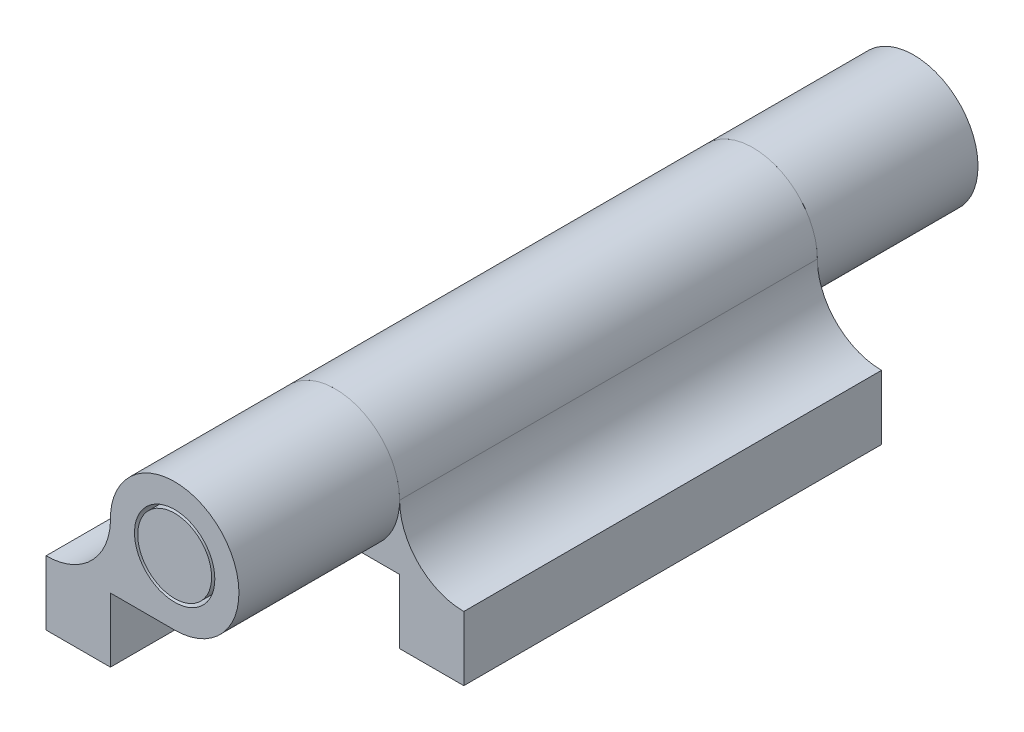
ISO-10303-21;
HEADER;
FILE_DESCRIPTION(('STEP AP214'),'2;1');
FILE_NAME('part.step','',(''),(''),'','','');
FILE_SCHEMA(('AUTOMOTIVE_DESIGN { 1 0 10303 214 1 1 1 1 }'));
ENDSEC;
DATA;
#1=APPLICATION_CONTEXT('core data for automotive mechanical design processes');
#2=APPLICATION_PROTOCOL_DEFINITION('international standard','automotive_design',2000,#1);
#3=PRODUCT_CONTEXT('',#1,'mechanical');
#4=PRODUCT('Part','Part','',(#3));
#5=PRODUCT_RELATED_PRODUCT_CATEGORY('part','',(#4));
#6=PRODUCT_DEFINITION_FORMATION('','',#4);
#7=PRODUCT_DEFINITION_CONTEXT('part definition',#1,'design');
#8=PRODUCT_DEFINITION('design','',#6,#7);
#9=PRODUCT_DEFINITION_SHAPE('','',#8);
#10=(LENGTH_UNIT() NAMED_UNIT(*) SI_UNIT(.MILLI.,.METRE.));
#11=(NAMED_UNIT(*) PLANE_ANGLE_UNIT() SI_UNIT($,.RADIAN.));
#12=(NAMED_UNIT(*) SI_UNIT($,.STERADIAN.) SOLID_ANGLE_UNIT());
#13=UNCERTAINTY_MEASURE_WITH_UNIT(LENGTH_MEASURE(1.E-05),#10,'distance_accuracy_value','');
#14=(GEOMETRIC_REPRESENTATION_CONTEXT(3) GLOBAL_UNCERTAINTY_ASSIGNED_CONTEXT((#13)) GLOBAL_UNIT_ASSIGNED_CONTEXT((#10,
#11,#12)) REPRESENTATION_CONTEXT('',''));
#15=CARTESIAN_POINT('',(0.,0.,0.));
#16=DIRECTION('',(0.,0.,1.));
#17=DIRECTION('',(1.,0.,0.));
#18=AXIS2_PLACEMENT_3D('',#15,#16,#17);
#19=CARTESIAN_POINT('',(7.33716722612504,0.000388335978682196,-11.5573838580648));
#20=DIRECTION('',(0.,0.,1.));
#21=DIRECTION('',(1.,0.,0.));
#22=AXIS2_PLACEMENT_3D('',#19,#20,#21);
#23=CYLINDRICAL_SURFACE('',#22,1.99961170172985);
#24=DIRECTION('',(0.,0.,1.));
#25=VECTOR('',#24,1.);
#26=CARTESIAN_POINT('',(7.33716722612504,2.00000001885427,-11.5573838580648));
#27=LINE('',#26,#25);
#28=CARTESIAN_POINT('',(7.33716722612504,2.,6.4428661419352));
#29=VERTEX_POINT('',#28);
#30=CARTESIAN_POINT('',(7.33716722612504,2.,-6.5571338580648));
#31=VERTEX_POINT('',#30);
#32=EDGE_CURVE('E171',#29,#31,#27,.F.);
#33=ORIENTED_EDGE('',*,*,#32,.F.);
#34=CARTESIAN_POINT('',(7.33716722612504,0.000388335978682196,6.44286614193519));
#35=DIRECTION('',(0.,0.,1.));
#36=DIRECTION('',(1.,0.,0.));
#37=AXIS2_PLACEMENT_3D('',#34,#35,#36);
#38=CIRCLE('',#37,1.99961170172985);
#39=CARTESIAN_POINT('',(7.33677889014635,2.,6.4428661419352));
#40=VERTEX_POINT('',#39);
#41=EDGE_CURVE('E107',#29,#40,#38,.T.);
#42=ORIENTED_EDGE('',*,*,#41,.T.);
#43=DIRECTION('',(0.,0.,1.));
#44=VECTOR('',#43,1.);
#45=CARTESIAN_POINT('',(7.33677889014635,2.,-16.0273685975336));
#46=LINE('',#45,#44);
#47=CARTESIAN_POINT('',(7.33677889014635,2.,-6.55713385806481));
#48=VERTEX_POINT('',#47);
#49=EDGE_CURVE('E210',#48,#40,#46,.T.);
#50=ORIENTED_EDGE('',*,*,#49,.F.);
#51=CARTESIAN_POINT('',(7.33716722612504,0.000388335978682196,-6.5571338580648));
#52=DIRECTION('',(0.,0.,-1.));
#53=DIRECTION('',(-1.,0.,0.));
#54=AXIS2_PLACEMENT_3D('',#51,#52,#53);
#55=CIRCLE('',#54,1.99961170172985);
#56=EDGE_CURVE('E231',#48,#31,#55,.T.);
#57=ORIENTED_EDGE('',*,*,#56,.T.);
#58=EDGE_LOOP('',(#33,#42,#50,#57));
#59=FACE_BOUND('',#58,.T.);
#60=ADVANCED_FACE('F99',(#59),#23,.F.);
#61=CARTESIAN_POINT('',(0.,0.,6.4428661419352));
#62=DIRECTION('',(0.,0.,1.));
#63=DIRECTION('',(1.,0.,0.));
#64=AXIS2_PLACEMENT_3D('',#61,#62,#63);
#65=PLANE('',#64);
#66=DIRECTION('',(-1.,0.,0.));
#67=VECTOR('',#66,1.);
#68=CARTESIAN_POINT('',(0.,2.,6.4428661419352));
#69=LINE('',#68,#67);
#70=CARTESIAN_POINT('',(9.33677889014635,2.,6.44286614193519));
#71=VERTEX_POINT('',#70);
#72=EDGE_CURVE('E190',#71,#29,#69,.T.);
#73=ORIENTED_EDGE('',*,*,#72,.F.);
#74=DIRECTION('',(0.,-1.,0.));
#75=VECTOR('',#74,1.);
#76=CARTESIAN_POINT('',(9.33677889014635,0.,6.4428661419352));
#77=LINE('',#76,#75);
#78=CARTESIAN_POINT('',(9.33677890900062,0.000388335978682196,6.4428661419352));
#79=VERTEX_POINT('',#78);
#80=EDGE_CURVE('E178',#71,#79,#77,.T.);
#81=ORIENTED_EDGE('',*,*,#80,.T.);
#82=CARTESIAN_POINT('',(9.33677889014637,0.,6.44286614193519));
#83=VERTEX_POINT('',#82);
#84=EDGE_CURVE('E14',#83,#79,#38,.T.);
#85=ORIENTED_EDGE('',*,*,#84,.F.);
#86=DIRECTION('',(-1.,0.,0.));
#87=VECTOR('',#86,1.);
#88=CARTESIAN_POINT('',(0.,0.,6.4428661419352));
#89=LINE('',#88,#87);
#90=CARTESIAN_POINT('',(11.334653153546,0.,6.4428661419352));
#91=VERTEX_POINT('',#90);
#92=EDGE_CURVE('E122',#91,#83,#89,.T.);
#93=ORIENTED_EDGE('',*,*,#92,.F.);
#94=DIRECTION('',(0.,-1.,0.));
#95=VECTOR('',#94,1.);
#96=CARTESIAN_POINT('',(11.334653153546,0.,6.4428661419352));
#97=LINE('',#96,#95);
#98=CARTESIAN_POINT('',(11.334653153546,2.,6.44286614193519));
#99=VERTEX_POINT('',#98);
#100=EDGE_CURVE('E203',#99,#91,#97,.T.);
#101=ORIENTED_EDGE('',*,*,#100,.F.);
#102=CARTESIAN_POINT('',(11.3367800210374,4.,6.44286614193519));
#103=DIRECTION('',(0.,0.,1.));
#104=DIRECTION('',(1.,0.,0.));
#105=AXIS2_PLACEMENT_3D('',#102,#103,#104);
#106=CIRCLE('',#105,2.00000113089101);
#107=CARTESIAN_POINT('',(9.33677889014635,4.,6.44286614193519));
#108=VERTEX_POINT('',#107);
#109=EDGE_CURVE('E209',#99,#108,#106,.F.);
#110=ORIENTED_EDGE('',*,*,#109,.T.);
#111=CARTESIAN_POINT('',(7.33677889014635,4.,6.4428661419352));
#112=DIRECTION('',(0.,0.,1.));
#113=DIRECTION('',(1.,0.,0.));
#114=AXIS2_PLACEMENT_3D('',#111,#112,#113);
#115=CIRCLE('',#114,2.);
#116=EDGE_CURVE('E213',#108,#40,#115,.T.);
#117=ORIENTED_EDGE('',*,*,#116,.T.);
#118=ORIENTED_EDGE('',*,*,#41,.F.);
#119=EDGE_LOOP('',(#73,#81,#85,#93,#101,#110,#117,#118));
#120=FACE_BOUND('',#119,.T.);
#121=CARTESIAN_POINT('',(7.33677889014635,4.,6.4428661419352));
#122=DIRECTION('',(0.,0.,1.));
#123=DIRECTION('',(1.,0.,0.));
#124=AXIS2_PLACEMENT_3D('',#121,#122,#123);
#125=CIRCLE('',#124,1.25);
#126=CARTESIAN_POINT('',(8.58677889014635,4.,6.4428661419352));
#127=VERTEX_POINT('',#126);
#128=EDGE_CURVE('E227',#127,#127,#125,.T.);
#129=ORIENTED_EDGE('',*,*,#128,.F.);
#130=EDGE_LOOP('',(#129));
#131=FACE_BOUND('',#130,.T.);
#132=ADVANCED_FACE('F101',(#120,#131),#65,.T.);
#133=CARTESIAN_POINT('',(0.,0.,-6.5571338580648));
#134=DIRECTION('',(0.,0.,-1.));
#135=DIRECTION('',(-1.,0.,0.));
#136=AXIS2_PLACEMENT_3D('',#133,#134,#135);
#137=PLANE('',#136);
#138=DIRECTION('',(1.,0.,0.));
#139=VECTOR('',#138,1.);
#140=CARTESIAN_POINT('',(0.,2.,-6.5571338580648));
#141=LINE('',#140,#139);
#142=CARTESIAN_POINT('',(9.33677889014635,2.,-6.5571338580648));
#143=VERTEX_POINT('',#142);
#144=EDGE_CURVE('E166',#31,#143,#141,.T.);
#145=ORIENTED_EDGE('',*,*,#144,.F.);
#146=ORIENTED_EDGE('',*,*,#56,.F.);
#147=CARTESIAN_POINT('',(7.33677889014635,4.,-6.55713385806481));
#148=DIRECTION('',(0.,0.,-1.));
#149=DIRECTION('',(-1.,0.,0.));
#150=AXIS2_PLACEMENT_3D('',#147,#148,#149);
#151=CIRCLE('',#150,2.);
#152=CARTESIAN_POINT('',(9.33677889014635,4.,-6.5571338580648));
#153=VERTEX_POINT('',#152);
#154=EDGE_CURVE('E221',#48,#153,#151,.T.);
#155=ORIENTED_EDGE('',*,*,#154,.T.);
#156=CARTESIAN_POINT('',(11.3367800210374,4.,-6.5571338580648));
#157=DIRECTION('',(0.,0.,-1.));
#158=DIRECTION('',(-1.,0.,0.));
#159=AXIS2_PLACEMENT_3D('',#156,#157,#158);
#160=CIRCLE('',#159,2.00000113089101);
#161=CARTESIAN_POINT('',(11.334653153546,2.,-6.5571338580648));
#162=VERTEX_POINT('',#161);
#163=EDGE_CURVE('E206',#153,#162,#160,.F.);
#164=ORIENTED_EDGE('',*,*,#163,.T.);
#165=DIRECTION('',(0.,-1.,0.));
#166=VECTOR('',#165,1.);
#167=CARTESIAN_POINT('',(11.334653153546,10.,-6.5571338580648));
#168=LINE('',#167,#166);
#169=CARTESIAN_POINT('',(11.334653153546,0.,-6.5571338580648));
#170=VERTEX_POINT('',#169);
#171=EDGE_CURVE('E200',#162,#170,#168,.T.);
#172=ORIENTED_EDGE('',*,*,#171,.T.);
#173=DIRECTION('',(1.,0.,0.));
#174=VECTOR('',#173,1.);
#175=CARTESIAN_POINT('',(0.,0.,-6.5571338580648));
#176=LINE('',#175,#174);
#177=CARTESIAN_POINT('',(9.33677889014637,0.,-6.5571338580648));
#178=VERTEX_POINT('',#177);
#179=EDGE_CURVE('E195',#178,#170,#176,.T.);
#180=ORIENTED_EDGE('',*,*,#179,.F.);
#181=CARTESIAN_POINT('',(9.33677892785489,0.000388335978682196,-6.5571338580648));
#182=VERTEX_POINT('',#181);
#183=EDGE_CURVE('E185',#182,#178,#55,.T.);
#184=ORIENTED_EDGE('',*,*,#183,.F.);
#185=DIRECTION('',(0.,1.,0.));
#186=VECTOR('',#185,1.);
#187=CARTESIAN_POINT('',(9.33677889014635,0.,-6.5571338580648));
#188=LINE('',#187,#186);
#189=EDGE_CURVE('E114',#182,#143,#188,.T.);
#190=ORIENTED_EDGE('',*,*,#189,.T.);
#191=EDGE_LOOP('',(#145,#146,#155,#164,#172,#180,#184,#190));
#192=FACE_BOUND('',#191,.T.);
#193=CARTESIAN_POINT('',(7.33677889014635,4.,-6.55713385806481));
#194=DIRECTION('',(0.,0.,-1.));
#195=DIRECTION('',(-1.,0.,0.));
#196=AXIS2_PLACEMENT_3D('',#193,#194,#195);
#197=CIRCLE('',#196,1.25);
#198=CARTESIAN_POINT('',(6.08677889014635,4.,-6.55713385806481));
#199=VERTEX_POINT('',#198);
#200=EDGE_CURVE('E224',#199,#199,#197,.T.);
#201=ORIENTED_EDGE('',*,*,#200,.F.);
#202=EDGE_LOOP('',(#201));
#203=FACE_BOUND('',#202,.T.);
#204=ADVANCED_FACE('F182',(#192,#203),#137,.T.);
#205=ORIENTED_EDGE('',*,*,#84,.T.);
#206=DIRECTION('',(0.,0.,1.));
#207=VECTOR('',#206,1.);
#208=CARTESIAN_POINT('',(9.33677890900062,0.000388335978682196,-11.5573838580648));
#209=LINE('',#208,#207);
#210=EDGE_CURVE('E179',#79,#182,#209,.F.);
#211=ORIENTED_EDGE('',*,*,#210,.T.);
#212=ORIENTED_EDGE('',*,*,#183,.T.);
#213=DIRECTION('',(0.,0.,-1.));
#214=VECTOR('',#213,1.);
#215=CARTESIAN_POINT('',(9.33677889014637,0.,-6.5571338580648));
#216=LINE('',#215,#214);
#217=EDGE_CURVE('E198',#83,#178,#216,.T.);
#218=ORIENTED_EDGE('',*,*,#217,.F.);
#219=EDGE_LOOP('',(#205,#211,#212,#218));
#220=FACE_BOUND('',#219,.T.);
#221=ADVANCED_FACE('F235',(#220),#23,.F.);
#222=CARTESIAN_POINT('',(7.33677889014635,4.,-40.2139881075572));
#223=DIRECTION('',(0.,0.,1.));
#224=DIRECTION('',(1.,0.,0.));
#225=AXIS2_PLACEMENT_3D('',#222,#223,#224);
#226=CYLINDRICAL_SURFACE('',#225,2.);
#227=ORIENTED_EDGE('',*,*,#154,.F.);
#228=ORIENTED_EDGE('',*,*,#49,.T.);
#229=ORIENTED_EDGE('',*,*,#116,.F.);
#230=DIRECTION('',(0.,0.,1.));
#231=VECTOR('',#230,1.);
#232=CARTESIAN_POINT('',(9.33677889014635,4.,-16.0273685975336));
#233=LINE('',#232,#231);
#234=EDGE_CURVE('E216',#153,#108,#233,.T.);
#235=ORIENTED_EDGE('',*,*,#234,.F.);
#236=EDGE_LOOP('',(#227,#228,#229,#235));
#237=FACE_BOUND('',#236,.T.);
#238=ADVANCED_FACE('F251',(#237),#226,.T.);
#239=CARTESIAN_POINT('',(7.33677889014635,4.,-40.2139881075572));
#240=DIRECTION('',(0.,0.,1.));
#241=DIRECTION('',(1.,0.,0.));
#242=AXIS2_PLACEMENT_3D('',#239,#240,#241);
#243=CYLINDRICAL_SURFACE('',#242,1.25);
#244=ORIENTED_EDGE('',*,*,#200,.T.);
#245=EDGE_LOOP('',(#244));
#246=FACE_BOUND('',#245,.T.);
#247=ORIENTED_EDGE('',*,*,#128,.T.);
#248=EDGE_LOOP('',(#247));
#249=FACE_BOUND('',#248,.T.);
#250=ADVANCED_FACE('F253',(#246,#249),#243,.F.);
#251=CARTESIAN_POINT('',(11.3367800210374,4.,-16.0273685975336));
#252=DIRECTION('',(0.,0.,1.));
#253=DIRECTION('',(1.,0.,0.));
#254=AXIS2_PLACEMENT_3D('',#251,#252,#253);
#255=CYLINDRICAL_SURFACE('',#254,2.00000113089101);
#256=ORIENTED_EDGE('',*,*,#109,.F.);
#257=DIRECTION('',(0.,0.,1.));
#258=VECTOR('',#257,1.);
#259=CARTESIAN_POINT('',(11.334653153546,2.,-16.0273685975336));
#260=LINE('',#259,#258);
#261=EDGE_CURVE('E214',#162,#99,#260,.T.);
#262=ORIENTED_EDGE('',*,*,#261,.F.);
#263=ORIENTED_EDGE('',*,*,#163,.F.);
#264=ORIENTED_EDGE('',*,*,#234,.T.);
#265=EDGE_LOOP('',(#256,#262,#263,#264));
#266=FACE_BOUND('',#265,.T.);
#267=ADVANCED_FACE('F246',(#266),#255,.F.);
#268=CARTESIAN_POINT('',(11.334653153546,10.,-6.5571338580648));
#269=DIRECTION('',(-1.,0.,0.));
#270=DIRECTION('',(0.,0.,1.));
#271=AXIS2_PLACEMENT_3D('',#268,#269,#270);
#272=PLANE('',#271);
#273=ORIENTED_EDGE('',*,*,#100,.T.);
#274=DIRECTION('',(0.,0.,1.));
#275=VECTOR('',#274,1.);
#276=CARTESIAN_POINT('',(11.334653153546,0.,11.4428661419352));
#277=LINE('',#276,#275);
#278=EDGE_CURVE('E192',#170,#91,#277,.T.);
#279=ORIENTED_EDGE('',*,*,#278,.F.);
#280=ORIENTED_EDGE('',*,*,#171,.F.);
#281=ORIENTED_EDGE('',*,*,#261,.T.);
#282=EDGE_LOOP('',(#273,#279,#280,#281));
#283=FACE_BOUND('',#282,.T.);
#284=ADVANCED_FACE('F242',(#283),#272,.F.);
#285=CARTESIAN_POINT('',(1.33465315354599,0.,11.4428661419352));
#286=DIRECTION('',(0.,1.,0.));
#287=DIRECTION('',(0.,0.,1.));
#288=AXIS2_PLACEMENT_3D('',#285,#286,#287);
#289=PLANE('',#288);
#290=ORIENTED_EDGE('',*,*,#92,.T.);
#291=ORIENTED_EDGE('',*,*,#217,.T.);
#292=ORIENTED_EDGE('',*,*,#179,.T.);
#293=ORIENTED_EDGE('',*,*,#278,.T.);
#294=EDGE_LOOP('',(#290,#291,#292,#293));
#295=FACE_BOUND('',#294,.T.);
#296=ADVANCED_FACE('F237',(#295),#289,.F.);
#297=CARTESIAN_POINT('',(0.,2.,0.));
#298=DIRECTION('',(0.,1.,0.));
#299=DIRECTION('',(0.,0.,1.));
#300=AXIS2_PLACEMENT_3D('',#297,#298,#299);
#301=PLANE('',#300);
#302=ORIENTED_EDGE('',*,*,#72,.T.);
#303=ORIENTED_EDGE('',*,*,#32,.T.);
#304=ORIENTED_EDGE('',*,*,#144,.T.);
#305=DIRECTION('',(0.,0.,1.));
#306=VECTOR('',#305,1.);
#307=CARTESIAN_POINT('',(9.33677889014635,2.,-11.5571338580648));
#308=LINE('',#307,#306);
#309=EDGE_CURVE('E168',#143,#71,#308,.T.);
#310=ORIENTED_EDGE('',*,*,#309,.T.);
#311=EDGE_LOOP('',(#302,#303,#304,#310));
#312=FACE_BOUND('',#311,.T.);
#313=ADVANCED_FACE('F167',(#312),#301,.F.);
#314=CARTESIAN_POINT('',(9.33677889014635,-23.3451019965122,-11.5571338580648));
#315=DIRECTION('',(-1.,0.,0.));
#316=DIRECTION('',(0.,0.,1.));
#317=AXIS2_PLACEMENT_3D('',#314,#315,#316);
#318=PLANE('',#317);
#319=ORIENTED_EDGE('',*,*,#210,.F.);
#320=ORIENTED_EDGE('',*,*,#80,.F.);
#321=ORIENTED_EDGE('',*,*,#309,.F.);
#322=ORIENTED_EDGE('',*,*,#189,.F.);
#323=EDGE_LOOP('',(#319,#320,#321,#322));
#324=FACE_BOUND('',#323,.T.);
#325=ADVANCED_FACE('F176',(#324),#318,.T.);
#326=CLOSED_SHELL('',(#60,#132,#204,#221,#238,#250,#267,#284,#296,#313,#325));
#327=MANIFOLD_SOLID_BREP('B2',#326);
#328=CARTESIAN_POINT('',(3.33301378208247,-2.,6.4428661419352));
#329=DIRECTION('',(0.,0.,1.));
#330=DIRECTION('',(1.,0.,0.));
#331=AXIS2_PLACEMENT_3D('',#328,#329,#330);
#332=PLANE('',#331);
#333=CARTESIAN_POINT('',(7.33677889014635,4.,6.4428661419352));
#334=DIRECTION('',(0.,0.,1.));
#335=DIRECTION('',(1.,0.,0.));
#336=AXIS2_PLACEMENT_3D('',#333,#334,#335);
#337=CIRCLE('',#336,1.25);
#338=CARTESIAN_POINT('',(8.58677889014635,4.,6.4428661419352));
#339=VERTEX_POINT('',#338);
#340=EDGE_CURVE('E685',#339,#339,#337,.T.);
#341=ORIENTED_EDGE('',*,*,#340,.T.);
#342=EDGE_LOOP('',(#341));
#343=FACE_BOUND('',#342,.T.);
#344=DIRECTION('',(1.,0.,0.));
#345=VECTOR('',#344,1.);
#346=CARTESIAN_POINT('',(3.33301378208247,2.,6.4428661419352));
#347=LINE('',#346,#345);
#348=CARTESIAN_POINT('',(3.33489114739808,2.,6.4428661419352));
#349=VERTEX_POINT('',#348);
#350=CARTESIAN_POINT('',(5.33755556210372,2.,6.4428661419352));
#351=VERTEX_POINT('',#350);
#352=EDGE_CURVE('E608',#349,#351,#347,.T.);
#353=ORIENTED_EDGE('',*,*,#352,.F.);
#354=CARTESIAN_POINT('',(3.33676851271369,4.0037242538775,6.44286614193519));
#355=DIRECTION('',(0.,0.,1.));
#356=DIRECTION('',(1.,0.,0.));
#357=AXIS2_PLACEMENT_3D('',#354,#355,#356);
#358=CIRCLE('',#357,2.00372777182407);
#359=CARTESIAN_POINT('',(5.3385590370091,3.91563520563563,6.4428661419352));
#360=VERTEX_POINT('',#359);
#361=EDGE_CURVE('E676',#349,#360,#358,.T.);
#362=ORIENTED_EDGE('',*,*,#361,.T.);
#363=CARTESIAN_POINT('',(7.33677889014635,4.,6.4428661419352));
#364=DIRECTION('',(0.,0.,1.));
#365=DIRECTION('',(1.,0.,0.));
#366=AXIS2_PLACEMENT_3D('',#363,#364,#365);
#367=CIRCLE('',#366,2.);
#368=CARTESIAN_POINT('',(7.33677889014635,2.,6.4428661419352));
#369=VERTEX_POINT('',#368);
#370=EDGE_CURVE('E680',#369,#360,#367,.T.);
#371=ORIENTED_EDGE('',*,*,#370,.F.);
#372=DIRECTION('',(-1.,0.,0.));
#373=VECTOR('',#372,1.);
#374=CARTESIAN_POINT('',(3.33301378208247,2.,6.4428661419352));
#375=LINE('',#374,#373);
#376=EDGE_CURVE('E631',#369,#351,#375,.T.);
#377=ORIENTED_EDGE('',*,*,#376,.T.);
#378=EDGE_LOOP('',(#353,#362,#371,#377));
#379=FACE_BOUND('',#378,.T.);
#380=ADVANCED_FACE('F431',(#343,#379),#332,.F.);
#381=CARTESIAN_POINT('',(7.33716722612504,0.000388335978676775,3.61526276220608));
#382=DIRECTION('',(0.,0.,1.));
#383=DIRECTION('',(1.,0.,0.));
#384=AXIS2_PLACEMENT_3D('',#381,#382,#383);
#385=CYLINDRICAL_SURFACE('',#384,1.99961170172985);
#386=CARTESIAN_POINT('',(7.33716722612504,0.000388335978676775,6.4428661419352));
#387=DIRECTION('',(0.,0.,1.));
#388=DIRECTION('',(1.,0.,0.));
#389=AXIS2_PLACEMENT_3D('',#386,#387,#388);
#390=CIRCLE('',#389,1.99961170172985);
#391=CARTESIAN_POINT('',(5.33755554324946,0.000388335978676775,6.4428661419352));
#392=VERTEX_POINT('',#391);
#393=CARTESIAN_POINT('',(5.33755556210372,0.,6.4428661419352));
#394=VERTEX_POINT('',#393);
#395=EDGE_CURVE('E658',#392,#394,#390,.T.);
#396=ORIENTED_EDGE('',*,*,#395,.F.);
#397=DIRECTION('',(0.,0.,1.));
#398=VECTOR('',#397,1.);
#399=CARTESIAN_POINT('',(5.33755554324946,0.000388335978676775,3.61526276220608));
#400=LINE('',#399,#398);
#401=CARTESIAN_POINT('',(5.33755556210372,0.000388335978675908,11.4428661419352));
#402=VERTEX_POINT('',#401);
#403=EDGE_CURVE('E627',#392,#402,#400,.T.);
#404=ORIENTED_EDGE('',*,*,#403,.T.);
#405=CARTESIAN_POINT('',(7.33716722612504,0.000388335978676775,11.4428661419352));
#406=DIRECTION('',(0.,0.,-1.));
#407=DIRECTION('',(-1.,0.,0.));
#408=AXIS2_PLACEMENT_3D('',#405,#406,#407);
#409=CIRCLE('',#408,1.99961170172985);
#410=CARTESIAN_POINT('',(5.33755556210372,0.,11.4428661419352));
#411=VERTEX_POINT('',#410);
#412=EDGE_CURVE('E657',#411,#402,#409,.T.);
#413=ORIENTED_EDGE('',*,*,#412,.F.);
#414=DIRECTION('',(0.,0.,1.));
#415=VECTOR('',#414,1.);
#416=CARTESIAN_POINT('',(5.33755556210372,0.,-11.5573838580648));
#417=LINE('',#416,#415);
#418=EDGE_CURVE('E645',#411,#394,#417,.F.);
#419=ORIENTED_EDGE('',*,*,#418,.T.);
#420=EDGE_LOOP('',(#396,#404,#413,#419));
#421=FACE_BOUND('',#420,.T.);
#422=ADVANCED_FACE('F784',(#421),#385,.F.);
#423=CARTESIAN_POINT('',(3.33301378208247,-2.,11.4428661419352));
#424=DIRECTION('',(1.,0.,0.));
#425=DIRECTION('',(0.,0.,-1.));
#426=AXIS2_PLACEMENT_3D('',#423,#424,#425);
#427=PLANE('',#426);
#428=DIRECTION('',(0.,1.,0.));
#429=VECTOR('',#428,1.);
#430=CARTESIAN_POINT('',(3.33301378208247,-2.,6.4428661419352));
#431=LINE('',#430,#429);
#432=CARTESIAN_POINT('',(3.33301378208247,0.,6.4428661419352));
#433=VERTEX_POINT('',#432);
#434=CARTESIAN_POINT('',(3.33301378208247,0.000388335978675908,6.4428661419352));
#435=VERTEX_POINT('',#434);
#436=EDGE_CURVE('E97',#433,#435,#431,.T.);
#437=ORIENTED_EDGE('',*,*,#436,.F.);
#438=DIRECTION('',(0.,0.,1.));
#439=VECTOR('',#438,1.);
#440=CARTESIAN_POINT('',(3.33301378208247,0.,11.4428661419352));
#441=LINE('',#440,#439);
#442=CARTESIAN_POINT('',(3.33301378208247,0.,11.4428661419352));
#443=VERTEX_POINT('',#442);
#444=EDGE_CURVE('E641',#433,#443,#441,.T.);
#445=ORIENTED_EDGE('',*,*,#444,.T.);
#446=DIRECTION('',(0.,1.,0.));
#447=VECTOR('',#446,1.);
#448=CARTESIAN_POINT('',(3.33301378208247,-2.,11.4428661419352));
#449=LINE('',#448,#447);
#450=CARTESIAN_POINT('',(3.33301378208247,2.,11.4428661419352));
#451=VERTEX_POINT('',#450);
#452=EDGE_CURVE('E442',#443,#451,#449,.T.);
#453=ORIENTED_EDGE('',*,*,#452,.T.);
#454=DIRECTION('',(0.,0.,1.));
#455=VECTOR('',#454,1.);
#456=CARTESIAN_POINT('',(3.33301378208247,2.,-16.0273685975335));
#457=LINE('',#456,#455);
#458=EDGE_CURVE('E669',#349,#451,#457,.T.);
#459=ORIENTED_EDGE('',*,*,#458,.F.);
#460=DIRECTION('',(0.,0.,-1.));
#461=VECTOR('',#460,1.);
#462=CARTESIAN_POINT('',(3.33301378208247,2.,9.27423234127093));
#463=LINE('',#462,#461);
#464=CARTESIAN_POINT('',(3.33489114739808,2.,-6.5571338580648));
#465=VERTEX_POINT('',#464);
#466=EDGE_CURVE('E695',#349,#465,#463,.T.);
#467=ORIENTED_EDGE('',*,*,#466,.T.);
#468=DIRECTION('',(0.,0.,1.));
#469=VECTOR('',#468,1.);
#470=CARTESIAN_POINT('',(3.33301378208247,2.,-16.0273685975335));
#471=LINE('',#470,#469);
#472=CARTESIAN_POINT('',(3.33301378208247,2.,-11.5571338580648));
#473=VERTEX_POINT('',#472);
#474=EDGE_CURVE('E733',#473,#465,#471,.T.);
#475=ORIENTED_EDGE('',*,*,#474,.F.);
#476=DIRECTION('',(0.,1.,0.));
#477=VECTOR('',#476,1.);
#478=CARTESIAN_POINT('',(3.33301378208247,4.,-11.5571338580648));
#479=LINE('',#478,#477);
#480=CARTESIAN_POINT('',(3.33301378208247,0.,-11.5571338580648));
#481=VERTEX_POINT('',#480);
#482=EDGE_CURVE('E583',#481,#473,#479,.T.);
#483=ORIENTED_EDGE('',*,*,#482,.F.);
#484=DIRECTION('',(0.,0.,1.));
#485=VECTOR('',#484,1.);
#486=CARTESIAN_POINT('',(3.33301378208247,0.,11.4428661419352));
#487=LINE('',#486,#485);
#488=CARTESIAN_POINT('',(3.33301378208247,0.,-6.5571338580648));
#489=VERTEX_POINT('',#488);
#490=EDGE_CURVE('E576',#481,#489,#487,.T.);
#491=ORIENTED_EDGE('',*,*,#490,.T.);
#492=DIRECTION('',(0.,-1.,0.));
#493=VECTOR('',#492,1.);
#494=CARTESIAN_POINT('',(3.33301378208247,0.,-6.5571338580648));
#495=LINE('',#494,#493);
#496=CARTESIAN_POINT('',(3.33301378208247,0.000388335978675908,-6.5571338580648));
#497=VERTEX_POINT('',#496);
#498=EDGE_CURVE('E586',#497,#489,#495,.T.);
#499=ORIENTED_EDGE('',*,*,#498,.F.);
#500=DIRECTION('',(0.,0.,-1.));
#501=VECTOR('',#500,1.);
#502=CARTESIAN_POINT('',(3.33301378208247,0.000388335978675908,9.27423234127093));
#503=LINE('',#502,#501);
#504=EDGE_CURVE('E602',#435,#497,#503,.T.);
#505=ORIENTED_EDGE('',*,*,#504,.F.);
#506=EDGE_LOOP('',(#437,#445,#453,#459,#467,#475,#483,#491,#499,#505));
#507=FACE_BOUND('',#506,.T.);
#508=ADVANCED_FACE('F433',(#507),#427,.F.);
#509=ORIENTED_EDGE('',*,*,#436,.T.);
#510=DIRECTION('',(1.,0.,0.));
#511=VECTOR('',#510,1.);
#512=CARTESIAN_POINT('',(3.33301378208247,0.000388335978675908,6.4428661419352));
#513=LINE('',#512,#511);
#514=EDGE_CURVE('E605',#435,#392,#513,.T.);
#515=ORIENTED_EDGE('',*,*,#514,.T.);
#516=ORIENTED_EDGE('',*,*,#395,.T.);
#517=DIRECTION('',(-1.,0.,0.));
#518=VECTOR('',#517,1.);
#519=CARTESIAN_POINT('',(3.33301378208247,0.,6.4428661419352));
#520=LINE('',#519,#518);
#521=EDGE_CURVE('E638',#394,#433,#520,.T.);
#522=ORIENTED_EDGE('',*,*,#521,.T.);
#523=EDGE_LOOP('',(#509,#515,#516,#522));
#524=FACE_BOUND('',#523,.T.);
#525=ADVANCED_FACE('F786',(#524),#332,.F.);
#526=CARTESIAN_POINT('',(3.33301378208247,-2.,11.4428661419352));
#527=DIRECTION('',(0.,0.,-1.));
#528=DIRECTION('',(-1.,0.,0.));
#529=AXIS2_PLACEMENT_3D('',#526,#527,#528);
#530=PLANE('',#529);
#531=DIRECTION('',(0.,1.,0.));
#532=VECTOR('',#531,1.);
#533=CARTESIAN_POINT('',(5.33755556210372,-23.3451019965122,11.4428661419352));
#534=LINE('',#533,#532);
#535=CARTESIAN_POINT('',(5.33755556210372,2.,11.4428661419352));
#536=VERTEX_POINT('',#535);
#537=EDGE_CURVE('E623',#402,#536,#534,.T.);
#538=ORIENTED_EDGE('',*,*,#537,.T.);
#539=DIRECTION('',(-1.,0.,0.));
#540=VECTOR('',#539,1.);
#541=CARTESIAN_POINT('',(5.33755556210372,2.,11.4428661419352));
#542=LINE('',#541,#540);
#543=CARTESIAN_POINT('',(7.33677889014635,2.,11.4428661419352));
#544=VERTEX_POINT('',#543);
#545=EDGE_CURVE('E620',#544,#536,#542,.T.);
#546=ORIENTED_EDGE('',*,*,#545,.F.);
#547=CARTESIAN_POINT('',(7.33677889014635,4.,11.4428661419352));
#548=DIRECTION('',(0.,0.,1.));
#549=DIRECTION('',(1.,0.,0.));
#550=AXIS2_PLACEMENT_3D('',#547,#548,#549);
#551=CIRCLE('',#550,2.);
#552=CARTESIAN_POINT('',(5.3385590370091,3.91563520563562,11.4428661419352));
#553=VERTEX_POINT('',#552);
#554=EDGE_CURVE('E649',#544,#553,#551,.T.);
#555=ORIENTED_EDGE('',*,*,#554,.T.);
#556=CARTESIAN_POINT('',(3.33676851271369,4.0037242538775,11.4428661419352));
#557=DIRECTION('',(0.,0.,1.));
#558=DIRECTION('',(1.,0.,0.));
#559=AXIS2_PLACEMENT_3D('',#556,#557,#558);
#560=CIRCLE('',#559,2.00372777182407);
#561=EDGE_CURVE('E661',#553,#451,#560,.F.);
#562=ORIENTED_EDGE('',*,*,#561,.T.);
#563=ORIENTED_EDGE('',*,*,#452,.F.);
#564=DIRECTION('',(1.,0.,0.));
#565=VECTOR('',#564,1.);
#566=CARTESIAN_POINT('',(1.33465315354599,0.,11.4428661419352));
#567=LINE('',#566,#565);
#568=EDGE_CURVE('E634',#443,#411,#567,.T.);
#569=ORIENTED_EDGE('',*,*,#568,.T.);
#570=ORIENTED_EDGE('',*,*,#412,.T.);
#571=EDGE_LOOP('',(#538,#546,#555,#562,#563,#569,#570));
#572=FACE_BOUND('',#571,.T.);
#573=CARTESIAN_POINT('',(7.33677889014635,4.,11.4428661419352));
#574=DIRECTION('',(0.,0.,1.));
#575=DIRECTION('',(1.,0.,0.));
#576=AXIS2_PLACEMENT_3D('',#573,#574,#575);
#577=CIRCLE('',#576,1.25);
#578=CARTESIAN_POINT('',(8.58677889014635,4.,11.4428661419352));
#579=VERTEX_POINT('',#578);
#580=EDGE_CURVE('E653',#579,#579,#577,.T.);
#581=ORIENTED_EDGE('',*,*,#580,.F.);
#582=EDGE_LOOP('',(#581));
#583=FACE_BOUND('',#582,.T.);
#584=ADVANCED_FACE('F795',(#572,#583),#530,.F.);
#585=CARTESIAN_POINT('',(3.33676851271369,4.0037242538775,-16.0273685975335));
#586=DIRECTION('',(0.,0.,1.));
#587=DIRECTION('',(1.,0.,0.));
#588=AXIS2_PLACEMENT_3D('',#585,#586,#587);
#589=CYLINDRICAL_SURFACE('',#588,2.00372777182407);
#590=ORIENTED_EDGE('',*,*,#458,.T.);
#591=ORIENTED_EDGE('',*,*,#561,.F.);
#592=DIRECTION('',(0.,0.,1.));
#593=VECTOR('',#592,1.);
#594=CARTESIAN_POINT('',(5.3385590370091,3.91563520563563,-16.0273685975336));
#595=LINE('',#594,#593);
#596=EDGE_CURVE('E675',#360,#553,#595,.T.);
#597=ORIENTED_EDGE('',*,*,#596,.F.);
#598=ORIENTED_EDGE('',*,*,#361,.F.);
#599=EDGE_LOOP('',(#590,#591,#597,#598));
#600=FACE_BOUND('',#599,.T.);
#601=ADVANCED_FACE('F800',(#600),#589,.F.);
#602=CARTESIAN_POINT('',(7.33677889014635,4.,-40.2139881075572));
#603=DIRECTION('',(0.,0.,1.));
#604=DIRECTION('',(1.,0.,0.));
#605=AXIS2_PLACEMENT_3D('',#602,#603,#604);
#606=CYLINDRICAL_SURFACE('',#605,1.25);
#607=ORIENTED_EDGE('',*,*,#340,.F.);
#608=EDGE_LOOP('',(#607));
#609=FACE_BOUND('',#608,.T.);
#610=ORIENTED_EDGE('',*,*,#580,.T.);
#611=EDGE_LOOP('',(#610));
#612=FACE_BOUND('',#611,.T.);
#613=ADVANCED_FACE('F840',(#609,#612),#606,.F.);
#614=CARTESIAN_POINT('',(7.33677889014635,4.,-40.2139881075572));
#615=DIRECTION('',(0.,0.,1.));
#616=DIRECTION('',(1.,0.,0.));
#617=AXIS2_PLACEMENT_3D('',#614,#615,#616);
#618=CYLINDRICAL_SURFACE('',#617,2.);
#619=DIRECTION('',(0.,0.,1.));
#620=VECTOR('',#619,1.);
#621=CARTESIAN_POINT('',(7.33677889014635,2.,-16.0273685975336));
#622=LINE('',#621,#620);
#623=EDGE_CURVE('E674',#369,#544,#622,.T.);
#624=ORIENTED_EDGE('',*,*,#623,.F.);
#625=ORIENTED_EDGE('',*,*,#370,.T.);
#626=ORIENTED_EDGE('',*,*,#596,.T.);
#627=ORIENTED_EDGE('',*,*,#554,.F.);
#628=EDGE_LOOP('',(#624,#625,#626,#627));
#629=FACE_BOUND('',#628,.T.);
#630=ADVANCED_FACE('F802',(#629),#618,.T.);
#631=CARTESIAN_POINT('',(1.33465315354599,0.,11.4428661419352));
#632=DIRECTION('',(0.,1.,0.));
#633=DIRECTION('',(0.,0.,1.));
#634=AXIS2_PLACEMENT_3D('',#631,#632,#633);
#635=PLANE('',#634);
#636=ORIENTED_EDGE('',*,*,#521,.F.);
#637=ORIENTED_EDGE('',*,*,#418,.F.);
#638=ORIENTED_EDGE('',*,*,#568,.F.);
#639=ORIENTED_EDGE('',*,*,#444,.F.);
#640=EDGE_LOOP('',(#636,#637,#638,#639));
#641=FACE_BOUND('',#640,.T.);
#642=ADVANCED_FACE('F827',(#641),#635,.F.);
#643=CARTESIAN_POINT('',(0.,2.,0.));
#644=DIRECTION('',(0.,1.,0.));
#645=DIRECTION('',(0.,0.,1.));
#646=AXIS2_PLACEMENT_3D('',#643,#644,#645);
#647=PLANE('',#646);
#648=ORIENTED_EDGE('',*,*,#623,.T.);
#649=ORIENTED_EDGE('',*,*,#545,.T.);
#650=DIRECTION('',(0.,0.,-1.));
#651=VECTOR('',#650,1.);
#652=CARTESIAN_POINT('',(5.33755556210372,2.,-11.5571338580648));
#653=LINE('',#652,#651);
#654=EDGE_CURVE('E616',#536,#351,#653,.T.);
#655=ORIENTED_EDGE('',*,*,#654,.T.);
#656=ORIENTED_EDGE('',*,*,#376,.F.);
#657=EDGE_LOOP('',(#648,#649,#655,#656));
#658=FACE_BOUND('',#657,.T.);
#659=ADVANCED_FACE('F822',(#658),#647,.F.);
#660=CARTESIAN_POINT('',(5.33755556210372,-23.3451019965122,-11.5571338580648));
#661=DIRECTION('',(1.,0.,0.));
#662=DIRECTION('',(0.,0.,-1.));
#663=AXIS2_PLACEMENT_3D('',#660,#661,#662);
#664=PLANE('',#663);
#665=ORIENTED_EDGE('',*,*,#403,.F.);
#666=DIRECTION('',(0.,0.,-1.));
#667=VECTOR('',#666,1.);
#668=CARTESIAN_POINT('',(5.33755556210372,0.000388335978675908,9.27423234127093));
#669=LINE('',#668,#667);
#670=CARTESIAN_POINT('',(5.33755556210372,0.000388335978675908,-6.5571338580648));
#671=VERTEX_POINT('',#670);
#672=EDGE_CURVE('E601',#392,#671,#669,.T.);
#673=ORIENTED_EDGE('',*,*,#672,.T.);
#674=DIRECTION('',(0.,0.,1.));
#675=VECTOR('',#674,1.);
#676=CARTESIAN_POINT('',(5.33755554324946,0.000388335978682196,-11.5573838580648));
#677=LINE('',#676,#675);
#678=CARTESIAN_POINT('',(5.33755556210372,0.000388335978682847,-11.5571338580648));
#679=VERTEX_POINT('',#678);
#680=EDGE_CURVE('E552',#671,#679,#677,.F.);
#681=ORIENTED_EDGE('',*,*,#680,.T.);
#682=DIRECTION('',(0.,1.,0.));
#683=VECTOR('',#682,1.);
#684=CARTESIAN_POINT('',(5.33755556210372,-23.3451019965122,-11.5571338580648));
#685=LINE('',#684,#683);
#686=CARTESIAN_POINT('',(5.33755556210372,2.,-11.5571338580648));
#687=VERTEX_POINT('',#686);
#688=EDGE_CURVE('E548',#679,#687,#685,.T.);
#689=ORIENTED_EDGE('',*,*,#688,.T.);
#690=DIRECTION('',(0.,0.,-1.));
#691=VECTOR('',#690,1.);
#692=CARTESIAN_POINT('',(5.33755556210372,2.,-11.5571338580648));
#693=LINE('',#692,#691);
#694=CARTESIAN_POINT('',(5.33755556210372,2.,-6.5571338580648));
#695=VERTEX_POINT('',#694);
#696=EDGE_CURVE('E535',#695,#687,#693,.T.);
#697=ORIENTED_EDGE('',*,*,#696,.F.);
#698=DIRECTION('',(0.,0.,-1.));
#699=VECTOR('',#698,1.);
#700=CARTESIAN_POINT('',(5.33755556210372,2.,9.27423234127093));
#701=LINE('',#700,#699);
#702=EDGE_CURVE('E613',#351,#695,#701,.T.);
#703=ORIENTED_EDGE('',*,*,#702,.F.);
#704=ORIENTED_EDGE('',*,*,#654,.F.);
#705=ORIENTED_EDGE('',*,*,#537,.F.);
#706=EDGE_LOOP('',(#665,#673,#681,#689,#697,#703,#704,#705));
#707=FACE_BOUND('',#706,.T.);
#708=ADVANCED_FACE('F550',(#707),#664,.T.);
#709=CARTESIAN_POINT('',(3.33301378208247,0.000388335978675908,9.27423234127093));
#710=DIRECTION('',(0.,1.,0.));
#711=DIRECTION('',(0.,0.,1.));
#712=AXIS2_PLACEMENT_3D('',#709,#710,#711);
#713=PLANE('',#712);
#714=ORIENTED_EDGE('',*,*,#514,.F.);
#715=ORIENTED_EDGE('',*,*,#504,.T.);
#716=DIRECTION('',(1.,0.,0.));
#717=VECTOR('',#716,1.);
#718=CARTESIAN_POINT('',(3.33301378208247,0.000388335978675908,-6.5571338580648));
#719=LINE('',#718,#717);
#720=EDGE_CURVE('E597',#497,#671,#719,.T.);
#721=ORIENTED_EDGE('',*,*,#720,.T.);
#722=ORIENTED_EDGE('',*,*,#672,.F.);
#723=EDGE_LOOP('',(#714,#715,#721,#722));
#724=FACE_BOUND('',#723,.T.);
#725=ADVANCED_FACE('F717',(#724),#713,.F.);
#726=CARTESIAN_POINT('',(3.33301378208247,2.,9.27423234127093));
#727=DIRECTION('',(0.,1.,0.));
#728=DIRECTION('',(0.,0.,1.));
#729=AXIS2_PLACEMENT_3D('',#726,#727,#728);
#730=PLANE('',#729);
#731=ORIENTED_EDGE('',*,*,#466,.F.);
#732=ORIENTED_EDGE('',*,*,#352,.T.);
#733=ORIENTED_EDGE('',*,*,#702,.T.);
#734=DIRECTION('',(1.,0.,0.));
#735=VECTOR('',#734,1.);
#736=CARTESIAN_POINT('',(3.33301378208247,2.,-6.5571338580648));
#737=LINE('',#736,#735);
#738=EDGE_CURVE('E692',#465,#695,#737,.T.);
#739=ORIENTED_EDGE('',*,*,#738,.F.);
#740=EDGE_LOOP('',(#731,#732,#733,#739));
#741=FACE_BOUND('',#740,.T.);
#742=ADVANCED_FACE('F897',(#741),#730,.T.);
#743=CARTESIAN_POINT('',(0.,0.,-6.5571338580648));
#744=DIRECTION('',(0.,0.,-1.));
#745=DIRECTION('',(-1.,0.,0.));
#746=AXIS2_PLACEMENT_3D('',#743,#744,#745);
#747=PLANE('',#746);
#748=ORIENTED_EDGE('',*,*,#720,.F.);
#749=ORIENTED_EDGE('',*,*,#498,.T.);
#750=DIRECTION('',(1.,0.,0.));
#751=VECTOR('',#750,1.);
#752=CARTESIAN_POINT('',(0.,0.,-6.5571338580648));
#753=LINE('',#752,#751);
#754=CARTESIAN_POINT('',(5.33755556210372,0.,-6.5571338580648));
#755=VERTEX_POINT('',#754);
#756=EDGE_CURVE('E572',#489,#755,#753,.T.);
#757=ORIENTED_EDGE('',*,*,#756,.T.);
#758=CARTESIAN_POINT('',(7.33716722612504,0.000388335978682196,-6.5571338580648));
#759=DIRECTION('',(0.,0.,-1.));
#760=DIRECTION('',(-1.,0.,0.));
#761=AXIS2_PLACEMENT_3D('',#758,#759,#760);
#762=CIRCLE('',#761,1.99961170172985);
#763=EDGE_CURVE('E589',#755,#671,#762,.T.);
#764=ORIENTED_EDGE('',*,*,#763,.T.);
#765=EDGE_LOOP('',(#748,#749,#757,#764));
#766=FACE_BOUND('',#765,.T.);
#767=ADVANCED_FACE('F726',(#766),#747,.F.);
#768=CARTESIAN_POINT('',(7.33716722612504,0.000388335978682196,-11.5573838580648));
#769=DIRECTION('',(0.,0.,1.));
#770=DIRECTION('',(1.,0.,0.));
#771=AXIS2_PLACEMENT_3D('',#768,#769,#770);
#772=CYLINDRICAL_SURFACE('',#771,1.99961170172985);
#773=ORIENTED_EDGE('',*,*,#680,.F.);
#774=ORIENTED_EDGE('',*,*,#763,.F.);
#775=DIRECTION('',(0.,0.,1.));
#776=VECTOR('',#775,1.);
#777=CARTESIAN_POINT('',(5.33755556210372,0.,-11.5571338580648));
#778=LINE('',#777,#776);
#779=CARTESIAN_POINT('',(5.33755556210372,0.,-11.5571338580648));
#780=VERTEX_POINT('',#779);
#781=EDGE_CURVE('E580',#780,#755,#778,.T.);
#782=ORIENTED_EDGE('',*,*,#781,.F.);
#783=CARTESIAN_POINT('',(7.33716722612504,0.000388335978682196,-11.5571338580648));
#784=DIRECTION('',(0.,0.,1.));
#785=DIRECTION('',(1.,0.,0.));
#786=AXIS2_PLACEMENT_3D('',#783,#784,#785);
#787=CIRCLE('',#786,1.99961170172985);
#788=EDGE_CURVE('E725',#679,#780,#787,.T.);
#789=ORIENTED_EDGE('',*,*,#788,.F.);
#790=EDGE_LOOP('',(#773,#774,#782,#789));
#791=FACE_BOUND('',#790,.T.);
#792=ADVANCED_FACE('F723',(#791),#772,.F.);
#793=CARTESIAN_POINT('',(7.33677889014635,4.,-40.2139881075572));
#794=DIRECTION('',(0.,0.,1.));
#795=DIRECTION('',(1.,0.,0.));
#796=AXIS2_PLACEMENT_3D('',#793,#794,#795);
#797=CYLINDRICAL_SURFACE('',#796,2.);
#798=DIRECTION('',(0.,0.,1.));
#799=VECTOR('',#798,1.);
#800=CARTESIAN_POINT('',(7.33677889014635,2.,-16.0273685975336));
#801=LINE('',#800,#799);
#802=CARTESIAN_POINT('',(7.33677889014635,2.,-11.5571338580648));
#803=VERTEX_POINT('',#802);
#804=CARTESIAN_POINT('',(7.33677889014635,2.,-6.5571338580648));
#805=VERTEX_POINT('',#804);
#806=EDGE_CURVE('E744',#803,#805,#801,.T.);
#807=ORIENTED_EDGE('',*,*,#806,.F.);
#808=CARTESIAN_POINT('',(7.33677889014635,4.,-11.5571338580648));
#809=DIRECTION('',(0.,0.,1.));
#810=DIRECTION('',(1.,0.,0.));
#811=AXIS2_PLACEMENT_3D('',#808,#809,#810);
#812=CIRCLE('',#811,2.);
#813=CARTESIAN_POINT('',(5.3385590370091,3.91563520563563,-11.5571338580648));
#814=VERTEX_POINT('',#813);
#815=EDGE_CURVE('E560',#803,#814,#812,.T.);
#816=ORIENTED_EDGE('',*,*,#815,.T.);
#817=DIRECTION('',(0.,0.,1.));
#818=VECTOR('',#817,1.);
#819=CARTESIAN_POINT('',(5.3385590370091,3.91563520563563,-16.0273685975336));
#820=LINE('',#819,#818);
#821=CARTESIAN_POINT('',(5.3385590370091,3.91563520563563,-6.55713385806481));
#822=VERTEX_POINT('',#821);
#823=EDGE_CURVE('E739',#814,#822,#820,.T.);
#824=ORIENTED_EDGE('',*,*,#823,.T.);
#825=CARTESIAN_POINT('',(7.33677889014635,4.,-6.55713385806481));
#826=DIRECTION('',(0.,0.,-1.));
#827=DIRECTION('',(-1.,0.,0.));
#828=AXIS2_PLACEMENT_3D('',#825,#826,#827);
#829=CIRCLE('',#828,2.);
#830=EDGE_CURVE('E595',#822,#805,#829,.T.);
#831=ORIENTED_EDGE('',*,*,#830,.T.);
#832=EDGE_LOOP('',(#807,#816,#824,#831));
#833=FACE_BOUND('',#832,.T.);
#834=ADVANCED_FACE('F764',(#833),#797,.T.);
#835=CARTESIAN_POINT('',(7.33677889014635,4.,-6.55713385806481));
#836=DIRECTION('',(0.,0.,-1.));
#837=DIRECTION('',(-1.,0.,0.));
#838=AXIS2_PLACEMENT_3D('',#835,#836,#837);
#839=CIRCLE('',#838,1.25);
#840=CARTESIAN_POINT('',(6.08677889014635,4.,-6.55713385806481));
#841=VERTEX_POINT('',#840);
#842=EDGE_CURVE('E710',#841,#841,#839,.T.);
#843=ORIENTED_EDGE('',*,*,#842,.T.);
#844=EDGE_LOOP('',(#843));
#845=FACE_BOUND('',#844,.T.);
#846=CARTESIAN_POINT('',(3.33676851271369,4.0037242538775,-6.5571338580648));
#847=DIRECTION('',(0.,0.,-1.));
#848=DIRECTION('',(-1.,0.,0.));
#849=AXIS2_PLACEMENT_3D('',#846,#847,#848);
#850=CIRCLE('',#849,2.00372777182407);
#851=EDGE_CURVE('E745',#822,#465,#850,.T.);
#852=ORIENTED_EDGE('',*,*,#851,.T.);
#853=ORIENTED_EDGE('',*,*,#738,.T.);
#854=DIRECTION('',(1.,0.,0.));
#855=VECTOR('',#854,1.);
#856=CARTESIAN_POINT('',(0.,2.,-6.5571338580648));
#857=LINE('',#856,#855);
#858=EDGE_CURVE('E542',#695,#805,#857,.T.);
#859=ORIENTED_EDGE('',*,*,#858,.T.);
#860=ORIENTED_EDGE('',*,*,#830,.F.);
#861=EDGE_LOOP('',(#852,#853,#859,#860));
#862=FACE_BOUND('',#861,.T.);
#863=ADVANCED_FACE('F766',(#845,#862),#747,.F.);
#864=CARTESIAN_POINT('',(7.33677889014635,4.,-11.5571338580648));
#865=DIRECTION('',(0.,0.,1.));
#866=DIRECTION('',(1.,0.,0.));
#867=AXIS2_PLACEMENT_3D('',#864,#865,#866);
#868=PLANE('',#867);
#869=CARTESIAN_POINT('',(7.33677889014635,4.,-11.5571338580648));
#870=DIRECTION('',(0.,0.,1.));
#871=DIRECTION('',(1.,0.,0.));
#872=AXIS2_PLACEMENT_3D('',#869,#870,#871);
#873=CIRCLE('',#872,1.25);
#874=CARTESIAN_POINT('',(8.58677889014635,4.,-11.5571338580648));
#875=VERTEX_POINT('',#874);
#876=EDGE_CURVE('E748',#875,#875,#873,.T.);
#877=ORIENTED_EDGE('',*,*,#876,.T.);
#878=EDGE_LOOP('',(#877));
#879=FACE_BOUND('',#878,.T.);
#880=ORIENTED_EDGE('',*,*,#815,.F.);
#881=DIRECTION('',(1.,0.,0.));
#882=VECTOR('',#881,1.);
#883=CARTESIAN_POINT('',(5.33755556210372,2.,-11.5571338580648));
#884=LINE('',#883,#882);
#885=EDGE_CURVE('E539',#687,#803,#884,.T.);
#886=ORIENTED_EDGE('',*,*,#885,.F.);
#887=ORIENTED_EDGE('',*,*,#688,.F.);
#888=ORIENTED_EDGE('',*,*,#788,.T.);
#889=DIRECTION('',(1.,0.,0.));
#890=VECTOR('',#889,1.);
#891=CARTESIAN_POINT('',(1.33465315354599,0.,-11.5571338580648));
#892=LINE('',#891,#890);
#893=EDGE_CURVE('E568',#481,#780,#892,.T.);
#894=ORIENTED_EDGE('',*,*,#893,.F.);
#895=ORIENTED_EDGE('',*,*,#482,.T.);
#896=CARTESIAN_POINT('',(3.33676851271369,4.0037242538775,-11.5571338580648));
#897=DIRECTION('',(0.,0.,1.));
#898=DIRECTION('',(1.,0.,0.));
#899=AXIS2_PLACEMENT_3D('',#896,#897,#898);
#900=CIRCLE('',#899,2.00372777182407);
#901=EDGE_CURVE('E730',#473,#814,#900,.T.);
#902=ORIENTED_EDGE('',*,*,#901,.T.);
#903=EDGE_LOOP('',(#880,#886,#887,#888,#894,#895,#902));
#904=FACE_BOUND('',#903,.T.);
#905=ADVANCED_FACE('F558',(#879,#904),#868,.F.);
#906=CARTESIAN_POINT('',(7.33677889014635,4.,-40.2139881075572));
#907=DIRECTION('',(0.,0.,1.));
#908=DIRECTION('',(1.,0.,0.));
#909=AXIS2_PLACEMENT_3D('',#906,#907,#908);
#910=CYLINDRICAL_SURFACE('',#909,1.25);
#911=ORIENTED_EDGE('',*,*,#842,.F.);
#912=EDGE_LOOP('',(#911));
#913=FACE_BOUND('',#912,.T.);
#914=ORIENTED_EDGE('',*,*,#876,.F.);
#915=EDGE_LOOP('',(#914));
#916=FACE_BOUND('',#915,.T.);
#917=ADVANCED_FACE('F780',(#913,#916),#910,.F.);
#918=CARTESIAN_POINT('',(3.33676851271369,4.0037242538775,-16.0273685975335));
#919=DIRECTION('',(0.,0.,1.));
#920=DIRECTION('',(1.,0.,0.));
#921=AXIS2_PLACEMENT_3D('',#918,#919,#920);
#922=CYLINDRICAL_SURFACE('',#921,2.00372777182407);
#923=ORIENTED_EDGE('',*,*,#474,.T.);
#924=ORIENTED_EDGE('',*,*,#851,.F.);
#925=ORIENTED_EDGE('',*,*,#823,.F.);
#926=ORIENTED_EDGE('',*,*,#901,.F.);
#927=EDGE_LOOP('',(#923,#924,#925,#926));
#928=FACE_BOUND('',#927,.T.);
#929=ADVANCED_FACE('F769',(#928),#922,.F.);
#930=CARTESIAN_POINT('',(1.33465315354599,0.,11.4428661419352));
#931=DIRECTION('',(0.,1.,0.));
#932=DIRECTION('',(0.,0.,1.));
#933=AXIS2_PLACEMENT_3D('',#930,#931,#932);
#934=PLANE('',#933);
#935=ORIENTED_EDGE('',*,*,#893,.T.);
#936=ORIENTED_EDGE('',*,*,#781,.T.);
#937=ORIENTED_EDGE('',*,*,#756,.F.);
#938=ORIENTED_EDGE('',*,*,#490,.F.);
#939=EDGE_LOOP('',(#935,#936,#937,#938));
#940=FACE_BOUND('',#939,.T.);
#941=ADVANCED_FACE('F772',(#940),#934,.F.);
#942=CARTESIAN_POINT('',(0.,2.,0.));
#943=DIRECTION('',(0.,1.,0.));
#944=DIRECTION('',(0.,0.,1.));
#945=AXIS2_PLACEMENT_3D('',#942,#943,#944);
#946=PLANE('',#945);
#947=ORIENTED_EDGE('',*,*,#696,.T.);
#948=ORIENTED_EDGE('',*,*,#885,.T.);
#949=ORIENTED_EDGE('',*,*,#806,.T.);
#950=ORIENTED_EDGE('',*,*,#858,.F.);
#951=EDGE_LOOP('',(#947,#948,#949,#950));
#952=FACE_BOUND('',#951,.T.);
#953=ADVANCED_FACE('F537',(#952),#946,.F.);
#954=CLOSED_SHELL('',(#380,#422,#508,#525,#584,#601,#613,#630,#642,#659,#708,#725,#742,#767,
#792,#834,#863,#905,#917,#929,#941,#953));
#955=MANIFOLD_SOLID_BREP('B8',#954);
#956=CARTESIAN_POINT('',(7.33677889014635,4.,-4.60982505152292));
#957=DIRECTION('',(0.,0.,1.));
#958=DIRECTION('',(1.,0.,0.));
#959=AXIS2_PLACEMENT_3D('',#956,#957,#958);
#960=CYLINDRICAL_SURFACE('',#959,1.15);
#961=CARTESIAN_POINT('',(7.33677889014635,4.,11.4428661419352));
#962=DIRECTION('',(0.,0.,1.));
#963=DIRECTION('',(1.,0.,0.));
#964=AXIS2_PLACEMENT_3D('',#961,#962,#963);
#965=CIRCLE('',#964,1.15);
#966=CARTESIAN_POINT('',(8.48677889014635,4.,11.4428661419352));
#967=VERTEX_POINT('',#966);
#968=EDGE_CURVE('E430',#967,#967,#965,.T.);
#969=ORIENTED_EDGE('',*,*,#968,.F.);
#970=EDGE_LOOP('',(#969));
#971=FACE_BOUND('',#970,.T.);
#972=CARTESIAN_POINT('',(7.33677889014634,4.,-11.5571338580648));
#973=DIRECTION('',(0.,0.,1.));
#974=DIRECTION('',(1.,0.,0.));
#975=AXIS2_PLACEMENT_3D('',#972,#973,#974);
#976=CIRCLE('',#975,1.15);
#977=CARTESIAN_POINT('',(8.48677889014634,4.,-11.5571338580648));
#978=VERTEX_POINT('',#977);
#979=EDGE_CURVE('E1185',#978,#978,#976,.T.);
#980=ORIENTED_EDGE('',*,*,#979,.T.);
#981=EDGE_LOOP('',(#980));
#982=FACE_BOUND('',#981,.T.);
#983=ADVANCED_FACE('F1179',(#971,#982),#960,.T.);
#984=CARTESIAN_POINT('',(7.33677889014635,4.,11.4428661419352));
#985=DIRECTION('',(0.,0.,1.));
#986=DIRECTION('',(1.,0.,0.));
#987=AXIS2_PLACEMENT_3D('',#984,#985,#986);
#988=PLANE('',#987);
#989=ORIENTED_EDGE('',*,*,#968,.T.);
#990=EDGE_LOOP('',(#989));
#991=FACE_BOUND('',#990,.T.);
#992=ADVANCED_FACE('F1194',(#991),#988,.T.);
#993=CARTESIAN_POINT('',(7.33677889014635,4.,-11.5571338580648));
#994=DIRECTION('',(0.,0.,1.));
#995=DIRECTION('',(1.,0.,0.));
#996=AXIS2_PLACEMENT_3D('',#993,#994,#995);
#997=PLANE('',#996);
#998=ORIENTED_EDGE('',*,*,#979,.F.);
#999=EDGE_LOOP('',(#998));
#1000=FACE_BOUND('',#999,.T.);
#1001=ADVANCED_FACE('F1192',(#1000),#997,.F.);
#1002=CLOSED_SHELL('',(#983,#992,#1001));
#1003=MANIFOLD_SOLID_BREP('B91',#1002);
#1004=ADVANCED_BREP_SHAPE_REPRESENTATION('',(#18,#327,#955,#1003),#14);
#1005=SHAPE_DEFINITION_REPRESENTATION(#9,#1004);
ENDSEC;
END-ISO-10303-21;
